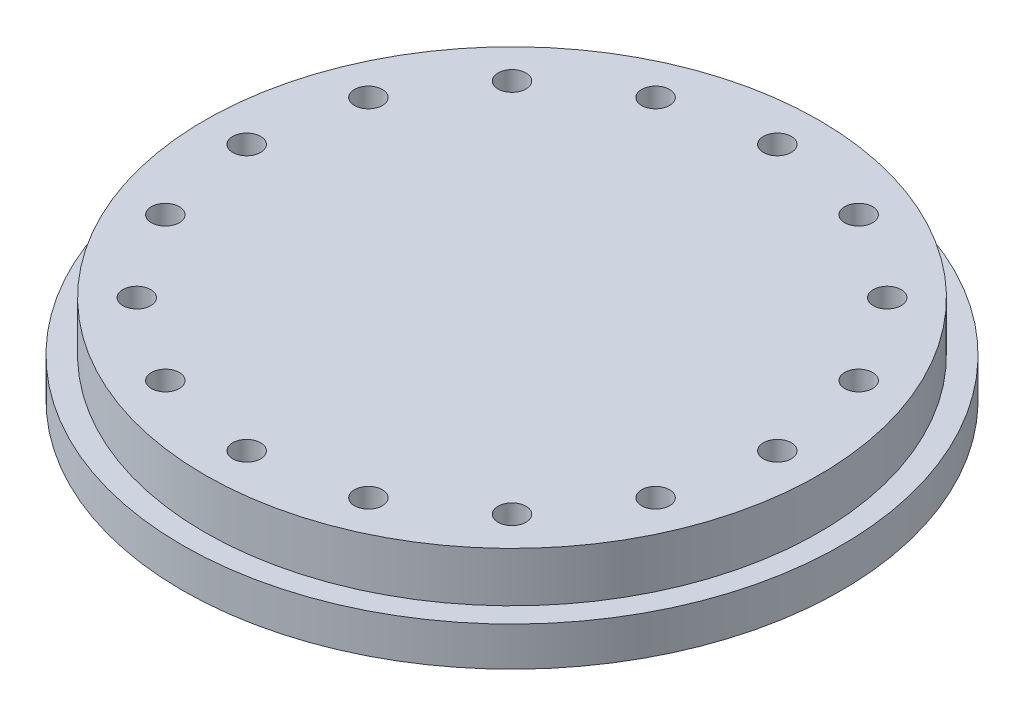
ISO-10303-21;
HEADER;
FILE_DESCRIPTION(('STEP AP214'),'2;1');
FILE_NAME('part.step','',(''),(''),'','','');
FILE_SCHEMA(('AUTOMOTIVE_DESIGN { 1 0 10303 214 1 1 1 1 }'));
ENDSEC;
DATA;
#1=APPLICATION_CONTEXT('core data for automotive mechanical design processes');
#2=APPLICATION_PROTOCOL_DEFINITION('international standard','automotive_design',2000,#1);
#3=PRODUCT_CONTEXT('',#1,'mechanical');
#4=PRODUCT('Part','Part','',(#3));
#5=PRODUCT_RELATED_PRODUCT_CATEGORY('part','',(#4));
#6=PRODUCT_DEFINITION_FORMATION('','',#4);
#7=PRODUCT_DEFINITION_CONTEXT('part definition',#1,'design');
#8=PRODUCT_DEFINITION('design','',#6,#7);
#9=PRODUCT_DEFINITION_SHAPE('','',#8);
#10=(LENGTH_UNIT() NAMED_UNIT(*) SI_UNIT(.MILLI.,.METRE.));
#11=(NAMED_UNIT(*) PLANE_ANGLE_UNIT() SI_UNIT($,.RADIAN.));
#12=(NAMED_UNIT(*) SI_UNIT($,.STERADIAN.) SOLID_ANGLE_UNIT());
#13=UNCERTAINTY_MEASURE_WITH_UNIT(LENGTH_MEASURE(1.E-05),#10,'distance_accuracy_value','');
#14=(GEOMETRIC_REPRESENTATION_CONTEXT(3) GLOBAL_UNCERTAINTY_ASSIGNED_CONTEXT((#13)) GLOBAL_UNIT_ASSIGNED_CONTEXT((#10,
#11,#12)) REPRESENTATION_CONTEXT('',''));
#15=CARTESIAN_POINT('',(0.,0.,0.));
#16=DIRECTION('',(0.,0.,1.));
#17=DIRECTION('',(1.,0.,0.));
#18=AXIS2_PLACEMENT_3D('',#15,#16,#17);
#19=CARTESIAN_POINT('',(0.,1.75,0.));
#20=DIRECTION('',(0.,-1.,0.));
#21=DIRECTION('',(0.,0.,-1.));
#22=AXIS2_PLACEMENT_3D('',#19,#20,#21);
#23=CYLINDRICAL_SURFACE('',#22,29.5);
#24=CARTESIAN_POINT('',(0.,1.75,0.));
#25=DIRECTION('',(0.,1.,0.));
#26=DIRECTION('',(0.,0.,1.));
#27=AXIS2_PLACEMENT_3D('',#24,#25,#26);
#28=CIRCLE('',#27,29.5);
#29=CARTESIAN_POINT('',(0.,1.75,29.5));
#30=VERTEX_POINT('',#29);
#31=EDGE_CURVE('E44',#30,#30,#28,.T.);
#32=ORIENTED_EDGE('',*,*,#31,.F.);
#33=EDGE_LOOP('',(#32));
#34=FACE_BOUND('',#33,.T.);
#35=CARTESIAN_POINT('',(0.,-1.75,0.));
#36=DIRECTION('',(0.,1.,0.));
#37=DIRECTION('',(0.,0.,1.));
#38=AXIS2_PLACEMENT_3D('',#35,#36,#37);
#39=CIRCLE('',#38,29.5);
#40=CARTESIAN_POINT('',(0.,-1.75,29.5));
#41=VERTEX_POINT('',#40);
#42=EDGE_CURVE('E40',#41,#41,#39,.T.);
#43=ORIENTED_EDGE('',*,*,#42,.T.);
#44=EDGE_LOOP('',(#43));
#45=FACE_BOUND('',#44,.T.);
#46=ADVANCED_FACE('F37',(#34,#45),#23,.T.);
#47=CARTESIAN_POINT('',(0.,1.75,0.));
#48=DIRECTION('',(0.,1.,0.));
#49=DIRECTION('',(0.,0.,1.));
#50=AXIS2_PLACEMENT_3D('',#47,#48,#49);
#51=PLANE('',#50);
#52=CARTESIAN_POINT('',(0.,1.75,0.));
#53=DIRECTION('',(0.,1.,0.));
#54=DIRECTION('',(0.,0.,1.));
#55=AXIS2_PLACEMENT_3D('',#52,#53,#54);
#56=CIRCLE('',#55,27.5);
#57=CARTESIAN_POINT('',(0.,1.75,27.5));
#58=VERTEX_POINT('',#57);
#59=EDGE_CURVE('E10',#58,#58,#56,.T.);
#60=ORIENTED_EDGE('',*,*,#59,.F.);
#61=EDGE_LOOP('',(#60));
#62=FACE_BOUND('',#61,.T.);
#63=ORIENTED_EDGE('',*,*,#31,.T.);
#64=EDGE_LOOP('',(#63));
#65=FACE_BOUND('',#64,.T.);
#66=ADVANCED_FACE('F165',(#62,#65),#51,.T.);
#67=CARTESIAN_POINT('',(0.,-1.75,0.));
#68=DIRECTION('',(0.,1.,0.));
#69=DIRECTION('',(0.,0.,1.));
#70=AXIS2_PLACEMENT_3D('',#67,#68,#69);
#71=PLANE('',#70);
#72=CARTESIAN_POINT('',(-16.7937860531805,-1.75,16.7937860531805));
#73=DIRECTION('',(0.,-1.,0.));
#74=DIRECTION('',(0.707106781186549,0.,-0.707106781186546));
#75=AXIS2_PLACEMENT_3D('',#72,#73,#74);
#76=CIRCLE('',#75,1.25);
#77=CARTESIAN_POINT('',(-15.9099025766974,-1.75,15.9099025766973));
#78=VERTEX_POINT('',#77);
#79=EDGE_CURVE('E109',#78,#78,#76,.T.);
#80=ORIENTED_EDGE('',*,*,#79,.F.);
#81=EDGE_LOOP('',(#80));
#82=FACE_BOUND('',#81,.T.);
#83=CARTESIAN_POINT('',(-21.9421388971431,-1.75,9.08873151867083));
#84=DIRECTION('',(0.,-1.,0.));
#85=DIRECTION('',(0.923879532511288,0.,-0.382683432365087));
#86=AXIS2_PLACEMENT_3D('',#83,#84,#85);
#87=CIRCLE('',#86,1.25);
#88=CARTESIAN_POINT('',(-20.787289481504,-1.75,8.61037722821447));
#89=VERTEX_POINT('',#88);
#90=EDGE_CURVE('E103',#89,#89,#87,.T.);
#91=ORIENTED_EDGE('',*,*,#90,.F.);
#92=EDGE_LOOP('',(#91));
#93=FACE_BOUND('',#92,.T.);
#94=CARTESIAN_POINT('',(-23.75,-1.75,0.));
#95=DIRECTION('',(0.,-1.,0.));
#96=DIRECTION('',(1.,0.,0.));
#97=AXIS2_PLACEMENT_3D('',#94,#95,#96);
#98=CIRCLE('',#97,1.25);
#99=CARTESIAN_POINT('',(-22.5,-1.75,0.));
#100=VERTEX_POINT('',#99);
#101=EDGE_CURVE('E97',#100,#100,#98,.T.);
#102=ORIENTED_EDGE('',*,*,#101,.F.);
#103=EDGE_LOOP('',(#102));
#104=FACE_BOUND('',#103,.T.);
#105=CARTESIAN_POINT('',(-21.942138897143,-1.75,-9.08873151867098));
#106=DIRECTION('',(0.,-1.,0.));
#107=DIRECTION('',(0.923879532511285,0.,0.382683432365094));
#108=AXIS2_PLACEMENT_3D('',#105,#106,#107);
#109=CIRCLE('',#108,1.25);
#110=CARTESIAN_POINT('',(-20.7872894815039,-1.75,-8.61037722821461));
#111=VERTEX_POINT('',#110);
#112=EDGE_CURVE('E91',#111,#111,#109,.T.);
#113=ORIENTED_EDGE('',*,*,#112,.F.);
#114=EDGE_LOOP('',(#113));
#115=FACE_BOUND('',#114,.T.);
#116=CARTESIAN_POINT('',(-16.7937860531804,-1.75,-16.7937860531806));
#117=DIRECTION('',(0.,-1.,0.));
#118=DIRECTION('',(0.707106781186544,0.,0.707106781186551));
#119=AXIS2_PLACEMENT_3D('',#116,#117,#118);
#120=CIRCLE('',#119,1.25);
#121=CARTESIAN_POINT('',(-15.9099025766972,-1.75,-15.9099025766974));
#122=VERTEX_POINT('',#121);
#123=EDGE_CURVE('E85',#122,#122,#120,.T.);
#124=ORIENTED_EDGE('',*,*,#123,.F.);
#125=EDGE_LOOP('',(#124));
#126=FACE_BOUND('',#125,.T.);
#127=CARTESIAN_POINT('',(-9.08873151867075,-1.75,-21.9421388971431));
#128=DIRECTION('',(0.,-1.,0.));
#129=DIRECTION('',(0.382683432365084,0.,0.923879532511289));
#130=AXIS2_PLACEMENT_3D('',#127,#128,#129);
#131=CIRCLE('',#130,1.25);
#132=CARTESIAN_POINT('',(-8.61037722821439,-1.75,-20.787289481504));
#133=VERTEX_POINT('',#132);
#134=EDGE_CURVE('E79',#133,#133,#131,.T.);
#135=ORIENTED_EDGE('',*,*,#134,.F.);
#136=EDGE_LOOP('',(#135));
#137=FACE_BOUND('',#136,.T.);
#138=CARTESIAN_POINT('',(0.,-1.75,-23.75));
#139=DIRECTION('',(0.,-1.,0.));
#140=DIRECTION('',(0.,0.,1.));
#141=AXIS2_PLACEMENT_3D('',#138,#139,#140);
#142=CIRCLE('',#141,1.25);
#143=CARTESIAN_POINT('',(0.,-1.75,-22.5));
#144=VERTEX_POINT('',#143);
#145=EDGE_CURVE('E73',#144,#144,#142,.T.);
#146=ORIENTED_EDGE('',*,*,#145,.F.);
#147=EDGE_LOOP('',(#146));
#148=FACE_BOUND('',#147,.T.);
#149=CARTESIAN_POINT('',(9.08873151867106,-1.75,-21.942138897143));
#150=DIRECTION('',(0.,-1.,0.));
#151=DIRECTION('',(-0.382683432365097,0.,0.923879532511284));
#152=AXIS2_PLACEMENT_3D('',#149,#150,#151);
#153=CIRCLE('',#152,1.25);
#154=CARTESIAN_POINT('',(8.61037722821469,-1.75,-20.7872894815039));
#155=VERTEX_POINT('',#154);
#156=EDGE_CURVE('E66',#155,#155,#153,.T.);
#157=ORIENTED_EDGE('',*,*,#156,.F.);
#158=EDGE_LOOP('',(#157));
#159=FACE_BOUND('',#158,.T.);
#160=CARTESIAN_POINT('',(16.7937860531807,-1.75,-16.7937860531804));
#161=DIRECTION('',(0.,-1.,0.));
#162=DIRECTION('',(-0.707106781186554,0.,0.707106781186541));
#163=AXIS2_PLACEMENT_3D('',#160,#161,#162);
#164=CIRCLE('',#163,1.25);
#165=CARTESIAN_POINT('',(15.9099025766975,-1.75,-15.9099025766972));
#166=VERTEX_POINT('',#165);
#167=EDGE_CURVE('E144',#166,#166,#164,.T.);
#168=ORIENTED_EDGE('',*,*,#167,.F.);
#169=EDGE_LOOP('',(#168));
#170=FACE_BOUND('',#169,.T.);
#171=CARTESIAN_POINT('',(21.9421388971432,-1.75,-9.08873151867066));
#172=DIRECTION('',(0.,-1.,0.));
#173=DIRECTION('',(-0.923879532511291,0.,0.382683432365081));
#174=AXIS2_PLACEMENT_3D('',#171,#172,#173);
#175=CIRCLE('',#174,1.25);
#176=CARTESIAN_POINT('',(20.787289481504,-1.75,-8.61037722821431));
#177=VERTEX_POINT('',#176);
#178=EDGE_CURVE('E138',#177,#177,#175,.T.);
#179=ORIENTED_EDGE('',*,*,#178,.F.);
#180=EDGE_LOOP('',(#179));
#181=FACE_BOUND('',#180,.T.);
#182=CARTESIAN_POINT('',(23.75,-1.75,2.48768045392573E-13));
#183=DIRECTION('',(0.,-1.,0.));
#184=DIRECTION('',(-1.,0.,0.));
#185=AXIS2_PLACEMENT_3D('',#182,#183,#184);
#186=CIRCLE('',#185,1.25);
#187=CARTESIAN_POINT('',(22.5,-1.75,2.35674990371912E-13));
#188=VERTEX_POINT('',#187);
#189=EDGE_CURVE('E132',#188,#188,#186,.T.);
#190=ORIENTED_EDGE('',*,*,#189,.F.);
#191=EDGE_LOOP('',(#190));
#192=FACE_BOUND('',#191,.T.);
#193=CARTESIAN_POINT('',(21.942138897143,-1.75,9.08873151867112));
#194=DIRECTION('',(0.,-1.,0.));
#195=DIRECTION('',(-0.923879532511283,0.,-0.3826834323651));
#196=AXIS2_PLACEMENT_3D('',#193,#194,#195);
#197=CIRCLE('',#196,1.25);
#198=CARTESIAN_POINT('',(20.7872894815039,-1.75,8.61037722821475));
#199=VERTEX_POINT('',#198);
#200=EDGE_CURVE('E126',#199,#199,#197,.T.);
#201=ORIENTED_EDGE('',*,*,#200,.F.);
#202=EDGE_LOOP('',(#201));
#203=FACE_BOUND('',#202,.T.);
#204=CARTESIAN_POINT('',(16.7937860531803,-1.75,16.7937860531807));
#205=DIRECTION('',(0.,-1.,0.));
#206=DIRECTION('',(-0.707106781186539,0.,-0.707106781186556));
#207=AXIS2_PLACEMENT_3D('',#204,#205,#206);
#208=CIRCLE('',#207,1.25);
#209=CARTESIAN_POINT('',(15.9099025766971,-1.75,15.9099025766975));
#210=VERTEX_POINT('',#209);
#211=EDGE_CURVE('E120',#210,#210,#208,.T.);
#212=ORIENTED_EDGE('',*,*,#211,.F.);
#213=EDGE_LOOP('',(#212));
#214=FACE_BOUND('',#213,.T.);
#215=CARTESIAN_POINT('',(9.08873151867059,-1.75,21.9421388971432));
#216=DIRECTION('',(0.,-1.,0.));
#217=DIRECTION('',(-0.382683432365077,0.,-0.923879532511292));
#218=AXIS2_PLACEMENT_3D('',#215,#216,#217);
#219=CIRCLE('',#218,1.25);
#220=CARTESIAN_POINT('',(8.61037722821424,-1.75,20.7872894815041));
#221=VERTEX_POINT('',#220);
#222=EDGE_CURVE('E114',#221,#221,#219,.T.);
#223=ORIENTED_EDGE('',*,*,#222,.F.);
#224=EDGE_LOOP('',(#223));
#225=FACE_BOUND('',#224,.T.);
#226=CARTESIAN_POINT('',(-9.0887315186709,-1.75,21.9421388971431));
#227=DIRECTION('',(0.,-1.,0.));
#228=DIRECTION('',(0.382683432365091,0.,-0.923879532511287));
#229=AXIS2_PLACEMENT_3D('',#226,#227,#228);
#230=CIRCLE('',#229,1.25);
#231=CARTESIAN_POINT('',(-8.61037722821454,-1.75,20.787289481504));
#232=VERTEX_POINT('',#231);
#233=EDGE_CURVE('E60',#232,#232,#230,.T.);
#234=ORIENTED_EDGE('',*,*,#233,.F.);
#235=EDGE_LOOP('',(#234));
#236=FACE_BOUND('',#235,.T.);
#237=CARTESIAN_POINT('',(0.,-1.75,23.75));
#238=DIRECTION('',(0.,-1.,0.));
#239=DIRECTION('',(0.,0.,-1.));
#240=AXIS2_PLACEMENT_3D('',#237,#238,#239);
#241=CIRCLE('',#240,1.25);
#242=CARTESIAN_POINT('',(0.,-1.75,22.5));
#243=VERTEX_POINT('',#242);
#244=EDGE_CURVE('E54',#243,#243,#241,.T.);
#245=ORIENTED_EDGE('',*,*,#244,.F.);
#246=EDGE_LOOP('',(#245));
#247=FACE_BOUND('',#246,.T.);
#248=ORIENTED_EDGE('',*,*,#42,.F.);
#249=EDGE_LOOP('',(#248));
#250=FACE_BOUND('',#249,.T.);
#251=ADVANCED_FACE('F161',(#82,#93,#104,#115,#126,#137,#148,#159,#170,#181,#192,#203,#214,#225,
#236,#247,#250),#71,.F.);
#252=CARTESIAN_POINT('',(0.,6.2,0.));
#253=DIRECTION('',(0.,-1.,0.));
#254=DIRECTION('',(0.,0.,-1.));
#255=AXIS2_PLACEMENT_3D('',#252,#253,#254);
#256=CYLINDRICAL_SURFACE('',#255,27.5);
#257=CARTESIAN_POINT('',(0.,6.2,0.));
#258=DIRECTION('',(0.,1.,0.));
#259=DIRECTION('',(0.,0.,1.));
#260=AXIS2_PLACEMENT_3D('',#257,#258,#259);
#261=CIRCLE('',#260,27.5);
#262=CARTESIAN_POINT('',(0.,6.2,27.5));
#263=VERTEX_POINT('',#262);
#264=EDGE_CURVE('E50',#263,#263,#261,.T.);
#265=ORIENTED_EDGE('',*,*,#264,.F.);
#266=EDGE_LOOP('',(#265));
#267=FACE_BOUND('',#266,.T.);
#268=ORIENTED_EDGE('',*,*,#59,.T.);
#269=EDGE_LOOP('',(#268));
#270=FACE_BOUND('',#269,.T.);
#271=ADVANCED_FACE('F164',(#267,#270),#256,.T.);
#272=CARTESIAN_POINT('',(0.,6.2,0.));
#273=DIRECTION('',(0.,1.,0.));
#274=DIRECTION('',(0.,0.,1.));
#275=AXIS2_PLACEMENT_3D('',#272,#273,#274);
#276=PLANE('',#275);
#277=CARTESIAN_POINT('',(-16.7937860531805,6.2,16.7937860531805));
#278=DIRECTION('',(0.,-1.,0.));
#279=DIRECTION('',(0.707106781186549,0.,-0.707106781186546));
#280=AXIS2_PLACEMENT_3D('',#277,#278,#279);
#281=CIRCLE('',#280,1.25);
#282=CARTESIAN_POINT('',(-15.9099025766974,6.2,15.9099025766973));
#283=VERTEX_POINT('',#282);
#284=EDGE_CURVE('E63',#283,#283,#281,.T.);
#285=ORIENTED_EDGE('',*,*,#284,.T.);
#286=EDGE_LOOP('',(#285));
#287=FACE_BOUND('',#286,.T.);
#288=CARTESIAN_POINT('',(-21.9421388971431,6.2,9.08873151867083));
#289=DIRECTION('',(0.,-1.,0.));
#290=DIRECTION('',(0.923879532511288,0.,-0.382683432365087));
#291=AXIS2_PLACEMENT_3D('',#288,#289,#290);
#292=CIRCLE('',#291,1.25);
#293=CARTESIAN_POINT('',(-20.787289481504,6.2,8.61037722821447));
#294=VERTEX_POINT('',#293);
#295=EDGE_CURVE('E106',#294,#294,#292,.T.);
#296=ORIENTED_EDGE('',*,*,#295,.T.);
#297=EDGE_LOOP('',(#296));
#298=FACE_BOUND('',#297,.T.);
#299=CARTESIAN_POINT('',(-23.75,6.2,0.));
#300=DIRECTION('',(0.,-1.,0.));
#301=DIRECTION('',(1.,0.,0.));
#302=AXIS2_PLACEMENT_3D('',#299,#300,#301);
#303=CIRCLE('',#302,1.25);
#304=CARTESIAN_POINT('',(-22.5,6.2,0.));
#305=VERTEX_POINT('',#304);
#306=EDGE_CURVE('E100',#305,#305,#303,.T.);
#307=ORIENTED_EDGE('',*,*,#306,.T.);
#308=EDGE_LOOP('',(#307));
#309=FACE_BOUND('',#308,.T.);
#310=CARTESIAN_POINT('',(-21.942138897143,6.2,-9.08873151867098));
#311=DIRECTION('',(0.,-1.,0.));
#312=DIRECTION('',(0.923879532511285,0.,0.382683432365094));
#313=AXIS2_PLACEMENT_3D('',#310,#311,#312);
#314=CIRCLE('',#313,1.25);
#315=CARTESIAN_POINT('',(-20.7872894815039,6.2,-8.61037722821461));
#316=VERTEX_POINT('',#315);
#317=EDGE_CURVE('E94',#316,#316,#314,.T.);
#318=ORIENTED_EDGE('',*,*,#317,.T.);
#319=EDGE_LOOP('',(#318));
#320=FACE_BOUND('',#319,.T.);
#321=CARTESIAN_POINT('',(-16.7937860531804,6.2,-16.7937860531806));
#322=DIRECTION('',(0.,-1.,0.));
#323=DIRECTION('',(0.707106781186544,0.,0.707106781186551));
#324=AXIS2_PLACEMENT_3D('',#321,#322,#323);
#325=CIRCLE('',#324,1.25);
#326=CARTESIAN_POINT('',(-15.9099025766972,6.2,-15.9099025766974));
#327=VERTEX_POINT('',#326);
#328=EDGE_CURVE('E88',#327,#327,#325,.T.);
#329=ORIENTED_EDGE('',*,*,#328,.T.);
#330=EDGE_LOOP('',(#329));
#331=FACE_BOUND('',#330,.T.);
#332=CARTESIAN_POINT('',(-9.08873151867075,6.2,-21.9421388971431));
#333=DIRECTION('',(0.,-1.,0.));
#334=DIRECTION('',(0.382683432365084,0.,0.923879532511289));
#335=AXIS2_PLACEMENT_3D('',#332,#333,#334);
#336=CIRCLE('',#335,1.25);
#337=CARTESIAN_POINT('',(-8.61037722821439,6.2,-20.787289481504));
#338=VERTEX_POINT('',#337);
#339=EDGE_CURVE('E82',#338,#338,#336,.T.);
#340=ORIENTED_EDGE('',*,*,#339,.T.);
#341=EDGE_LOOP('',(#340));
#342=FACE_BOUND('',#341,.T.);
#343=CARTESIAN_POINT('',(0.,6.2,-23.75));
#344=DIRECTION('',(0.,-1.,0.));
#345=DIRECTION('',(0.,0.,1.));
#346=AXIS2_PLACEMENT_3D('',#343,#344,#345);
#347=CIRCLE('',#346,1.25);
#348=CARTESIAN_POINT('',(0.,6.2,-22.5));
#349=VERTEX_POINT('',#348);
#350=EDGE_CURVE('E76',#349,#349,#347,.T.);
#351=ORIENTED_EDGE('',*,*,#350,.T.);
#352=EDGE_LOOP('',(#351));
#353=FACE_BOUND('',#352,.T.);
#354=CARTESIAN_POINT('',(9.08873151867106,6.2,-21.942138897143));
#355=DIRECTION('',(0.,-1.,0.));
#356=DIRECTION('',(-0.382683432365097,0.,0.923879532511284));
#357=AXIS2_PLACEMENT_3D('',#354,#355,#356);
#358=CIRCLE('',#357,1.25);
#359=CARTESIAN_POINT('',(8.61037722821469,6.2,-20.7872894815039));
#360=VERTEX_POINT('',#359);
#361=EDGE_CURVE('E69',#360,#360,#358,.T.);
#362=ORIENTED_EDGE('',*,*,#361,.T.);
#363=EDGE_LOOP('',(#362));
#364=FACE_BOUND('',#363,.T.);
#365=CARTESIAN_POINT('',(16.7937860531807,6.2,-16.7937860531804));
#366=DIRECTION('',(0.,-1.,0.));
#367=DIRECTION('',(-0.707106781186554,0.,0.707106781186541));
#368=AXIS2_PLACEMENT_3D('',#365,#366,#367);
#369=CIRCLE('',#368,1.25);
#370=CARTESIAN_POINT('',(15.9099025766975,6.2,-15.9099025766972));
#371=VERTEX_POINT('',#370);
#372=EDGE_CURVE('E70',#371,#371,#369,.T.);
#373=ORIENTED_EDGE('',*,*,#372,.T.);
#374=EDGE_LOOP('',(#373));
#375=FACE_BOUND('',#374,.T.);
#376=CARTESIAN_POINT('',(21.9421388971432,6.2,-9.08873151867066));
#377=DIRECTION('',(0.,-1.,0.));
#378=DIRECTION('',(-0.923879532511291,0.,0.382683432365081));
#379=AXIS2_PLACEMENT_3D('',#376,#377,#378);
#380=CIRCLE('',#379,1.25);
#381=CARTESIAN_POINT('',(20.787289481504,6.2,-8.61037722821431));
#382=VERTEX_POINT('',#381);
#383=EDGE_CURVE('E141',#382,#382,#380,.T.);
#384=ORIENTED_EDGE('',*,*,#383,.T.);
#385=EDGE_LOOP('',(#384));
#386=FACE_BOUND('',#385,.T.);
#387=CARTESIAN_POINT('',(23.75,6.2,2.48768045392573E-13));
#388=DIRECTION('',(0.,-1.,0.));
#389=DIRECTION('',(-1.,0.,0.));
#390=AXIS2_PLACEMENT_3D('',#387,#388,#389);
#391=CIRCLE('',#390,1.25);
#392=CARTESIAN_POINT('',(22.5,6.2,2.35674990371912E-13));
#393=VERTEX_POINT('',#392);
#394=EDGE_CURVE('E135',#393,#393,#391,.T.);
#395=ORIENTED_EDGE('',*,*,#394,.T.);
#396=EDGE_LOOP('',(#395));
#397=FACE_BOUND('',#396,.T.);
#398=CARTESIAN_POINT('',(21.942138897143,6.2,9.08873151867112));
#399=DIRECTION('',(0.,-1.,0.));
#400=DIRECTION('',(-0.923879532511283,0.,-0.3826834323651));
#401=AXIS2_PLACEMENT_3D('',#398,#399,#400);
#402=CIRCLE('',#401,1.25);
#403=CARTESIAN_POINT('',(20.7872894815039,6.2,8.61037722821475));
#404=VERTEX_POINT('',#403);
#405=EDGE_CURVE('E129',#404,#404,#402,.T.);
#406=ORIENTED_EDGE('',*,*,#405,.T.);
#407=EDGE_LOOP('',(#406));
#408=FACE_BOUND('',#407,.T.);
#409=CARTESIAN_POINT('',(16.7937860531803,6.2,16.7937860531807));
#410=DIRECTION('',(0.,-1.,0.));
#411=DIRECTION('',(-0.707106781186539,0.,-0.707106781186556));
#412=AXIS2_PLACEMENT_3D('',#409,#410,#411);
#413=CIRCLE('',#412,1.25);
#414=CARTESIAN_POINT('',(15.9099025766971,6.2,15.9099025766975));
#415=VERTEX_POINT('',#414);
#416=EDGE_CURVE('E123',#415,#415,#413,.T.);
#417=ORIENTED_EDGE('',*,*,#416,.T.);
#418=EDGE_LOOP('',(#417));
#419=FACE_BOUND('',#418,.T.);
#420=CARTESIAN_POINT('',(9.08873151867059,6.2,21.9421388971432));
#421=DIRECTION('',(0.,-1.,0.));
#422=DIRECTION('',(-0.382683432365077,0.,-0.923879532511292));
#423=AXIS2_PLACEMENT_3D('',#420,#421,#422);
#424=CIRCLE('',#423,1.25);
#425=CARTESIAN_POINT('',(8.61037722821424,6.2,20.7872894815041));
#426=VERTEX_POINT('',#425);
#427=EDGE_CURVE('E117',#426,#426,#424,.T.);
#428=ORIENTED_EDGE('',*,*,#427,.T.);
#429=EDGE_LOOP('',(#428));
#430=FACE_BOUND('',#429,.T.);
#431=CARTESIAN_POINT('',(-9.0887315186709,6.2,21.9421388971431));
#432=DIRECTION('',(0.,-1.,0.));
#433=DIRECTION('',(0.382683432365091,0.,-0.923879532511287));
#434=AXIS2_PLACEMENT_3D('',#431,#432,#433);
#435=CIRCLE('',#434,1.25);
#436=CARTESIAN_POINT('',(-8.61037722821454,6.2,20.787289481504));
#437=VERTEX_POINT('',#436);
#438=EDGE_CURVE('E57',#437,#437,#435,.T.);
#439=ORIENTED_EDGE('',*,*,#438,.T.);
#440=EDGE_LOOP('',(#439));
#441=FACE_BOUND('',#440,.T.);
#442=CARTESIAN_POINT('',(0.,6.2,23.75));
#443=DIRECTION('',(0.,-1.,0.));
#444=DIRECTION('',(0.,0.,-1.));
#445=AXIS2_PLACEMENT_3D('',#442,#443,#444);
#446=CIRCLE('',#445,1.25);
#447=CARTESIAN_POINT('',(0.,6.2,22.5));
#448=VERTEX_POINT('',#447);
#449=EDGE_CURVE('E53',#448,#448,#446,.T.);
#450=ORIENTED_EDGE('',*,*,#449,.T.);
#451=EDGE_LOOP('',(#450));
#452=FACE_BOUND('',#451,.T.);
#453=ORIENTED_EDGE('',*,*,#264,.T.);
#454=EDGE_LOOP('',(#453));
#455=FACE_BOUND('',#454,.T.);
#456=ADVANCED_FACE('F150',(#287,#298,#309,#320,#331,#342,#353,#364,#375,#386,#397,#408,#419,
#430,#441,#452,#455),#276,.T.);
#457=CARTESIAN_POINT('',(0.,6.2,23.75));
#458=DIRECTION('',(0.,-1.,0.));
#459=DIRECTION('',(0.,0.,-1.));
#460=AXIS2_PLACEMENT_3D('',#457,#458,#459);
#461=CYLINDRICAL_SURFACE('',#460,1.25);
#462=ORIENTED_EDGE('',*,*,#449,.F.);
#463=EDGE_LOOP('',(#462));
#464=FACE_BOUND('',#463,.T.);
#465=ORIENTED_EDGE('',*,*,#244,.T.);
#466=EDGE_LOOP('',(#465));
#467=FACE_BOUND('',#466,.T.);
#468=ADVANCED_FACE('F201',(#464,#467),#461,.F.);
#469=CARTESIAN_POINT('',(-9.0887315186709,6.2,21.9421388971431));
#470=DIRECTION('',(0.,-1.,0.));
#471=DIRECTION('',(0.,0.,-1.));
#472=AXIS2_PLACEMENT_3D('',#469,#470,#471);
#473=CYLINDRICAL_SURFACE('',#472,1.25);
#474=ORIENTED_EDGE('',*,*,#438,.F.);
#475=EDGE_LOOP('',(#474));
#476=FACE_BOUND('',#475,.T.);
#477=ORIENTED_EDGE('',*,*,#233,.T.);
#478=EDGE_LOOP('',(#477));
#479=FACE_BOUND('',#478,.T.);
#480=ADVANCED_FACE('F205',(#476,#479),#473,.F.);
#481=CARTESIAN_POINT('',(9.08873151867059,6.2,21.9421388971432));
#482=DIRECTION('',(0.,-1.,0.));
#483=DIRECTION('',(0.,0.,-1.));
#484=AXIS2_PLACEMENT_3D('',#481,#482,#483);
#485=CYLINDRICAL_SURFACE('',#484,1.25);
#486=ORIENTED_EDGE('',*,*,#427,.F.);
#487=EDGE_LOOP('',(#486));
#488=FACE_BOUND('',#487,.T.);
#489=ORIENTED_EDGE('',*,*,#222,.T.);
#490=EDGE_LOOP('',(#489));
#491=FACE_BOUND('',#490,.T.);
#492=ADVANCED_FACE('F209',(#488,#491),#485,.F.);
#493=CARTESIAN_POINT('',(16.7937860531803,6.2,16.7937860531807));
#494=DIRECTION('',(0.,-1.,0.));
#495=DIRECTION('',(0.,0.,-1.));
#496=AXIS2_PLACEMENT_3D('',#493,#494,#495);
#497=CYLINDRICAL_SURFACE('',#496,1.25);
#498=ORIENTED_EDGE('',*,*,#416,.F.);
#499=EDGE_LOOP('',(#498));
#500=FACE_BOUND('',#499,.T.);
#501=ORIENTED_EDGE('',*,*,#211,.T.);
#502=EDGE_LOOP('',(#501));
#503=FACE_BOUND('',#502,.T.);
#504=ADVANCED_FACE('F244',(#500,#503),#497,.F.);
#505=CARTESIAN_POINT('',(21.942138897143,6.2,9.08873151867112));
#506=DIRECTION('',(0.,-1.,0.));
#507=DIRECTION('',(0.,0.,-1.));
#508=AXIS2_PLACEMENT_3D('',#505,#506,#507);
#509=CYLINDRICAL_SURFACE('',#508,1.25);
#510=ORIENTED_EDGE('',*,*,#405,.F.);
#511=EDGE_LOOP('',(#510));
#512=FACE_BOUND('',#511,.T.);
#513=ORIENTED_EDGE('',*,*,#200,.T.);
#514=EDGE_LOOP('',(#513));
#515=FACE_BOUND('',#514,.T.);
#516=ADVANCED_FACE('F248',(#512,#515),#509,.F.);
#517=CARTESIAN_POINT('',(23.75,6.2,2.48768045392573E-13));
#518=DIRECTION('',(0.,-1.,0.));
#519=DIRECTION('',(0.,0.,-1.));
#520=AXIS2_PLACEMENT_3D('',#517,#518,#519);
#521=CYLINDRICAL_SURFACE('',#520,1.25);
#522=ORIENTED_EDGE('',*,*,#394,.F.);
#523=EDGE_LOOP('',(#522));
#524=FACE_BOUND('',#523,.T.);
#525=ORIENTED_EDGE('',*,*,#189,.T.);
#526=EDGE_LOOP('',(#525));
#527=FACE_BOUND('',#526,.T.);
#528=ADVANCED_FACE('F252',(#524,#527),#521,.F.);
#529=CARTESIAN_POINT('',(21.9421388971432,6.2,-9.08873151867066));
#530=DIRECTION('',(0.,-1.,0.));
#531=DIRECTION('',(0.,0.,-1.));
#532=AXIS2_PLACEMENT_3D('',#529,#530,#531);
#533=CYLINDRICAL_SURFACE('',#532,1.25);
#534=ORIENTED_EDGE('',*,*,#383,.F.);
#535=EDGE_LOOP('',(#534));
#536=FACE_BOUND('',#535,.T.);
#537=ORIENTED_EDGE('',*,*,#178,.T.);
#538=EDGE_LOOP('',(#537));
#539=FACE_BOUND('',#538,.T.);
#540=ADVANCED_FACE('F157',(#536,#539),#533,.F.);
#541=CARTESIAN_POINT('',(16.7937860531807,6.2,-16.7937860531804));
#542=DIRECTION('',(0.,-1.,0.));
#543=DIRECTION('',(0.,0.,-1.));
#544=AXIS2_PLACEMENT_3D('',#541,#542,#543);
#545=CYLINDRICAL_SURFACE('',#544,1.25);
#546=ORIENTED_EDGE('',*,*,#372,.F.);
#547=EDGE_LOOP('',(#546));
#548=FACE_BOUND('',#547,.T.);
#549=ORIENTED_EDGE('',*,*,#167,.T.);
#550=EDGE_LOOP('',(#549));
#551=FACE_BOUND('',#550,.T.);
#552=ADVANCED_FACE('F153',(#548,#551),#545,.F.);
#553=CARTESIAN_POINT('',(9.08873151867106,6.2,-21.942138897143));
#554=DIRECTION('',(0.,-1.,0.));
#555=DIRECTION('',(0.,0.,-1.));
#556=AXIS2_PLACEMENT_3D('',#553,#554,#555);
#557=CYLINDRICAL_SURFACE('',#556,1.25);
#558=ORIENTED_EDGE('',*,*,#361,.F.);
#559=EDGE_LOOP('',(#558));
#560=FACE_BOUND('',#559,.T.);
#561=ORIENTED_EDGE('',*,*,#156,.T.);
#562=EDGE_LOOP('',(#561));
#563=FACE_BOUND('',#562,.T.);
#564=ADVANCED_FACE('F156',(#560,#563),#557,.F.);
#565=CARTESIAN_POINT('',(0.,6.2,-23.75));
#566=DIRECTION('',(0.,-1.,0.));
#567=DIRECTION('',(0.,0.,-1.));
#568=AXIS2_PLACEMENT_3D('',#565,#566,#567);
#569=CYLINDRICAL_SURFACE('',#568,1.25);
#570=ORIENTED_EDGE('',*,*,#350,.F.);
#571=EDGE_LOOP('',(#570));
#572=FACE_BOUND('',#571,.T.);
#573=ORIENTED_EDGE('',*,*,#145,.T.);
#574=EDGE_LOOP('',(#573));
#575=FACE_BOUND('',#574,.T.);
#576=ADVANCED_FACE('F213',(#572,#575),#569,.F.);
#577=CARTESIAN_POINT('',(-9.08873151867075,6.2,-21.9421388971431));
#578=DIRECTION('',(0.,-1.,0.));
#579=DIRECTION('',(0.,0.,-1.));
#580=AXIS2_PLACEMENT_3D('',#577,#578,#579);
#581=CYLINDRICAL_SURFACE('',#580,1.25);
#582=ORIENTED_EDGE('',*,*,#339,.F.);
#583=EDGE_LOOP('',(#582));
#584=FACE_BOUND('',#583,.T.);
#585=ORIENTED_EDGE('',*,*,#134,.T.);
#586=EDGE_LOOP('',(#585));
#587=FACE_BOUND('',#586,.T.);
#588=ADVANCED_FACE('F217',(#584,#587),#581,.F.);
#589=CARTESIAN_POINT('',(-16.7937860531804,6.2,-16.7937860531806));
#590=DIRECTION('',(0.,-1.,0.));
#591=DIRECTION('',(0.,0.,-1.));
#592=AXIS2_PLACEMENT_3D('',#589,#590,#591);
#593=CYLINDRICAL_SURFACE('',#592,1.25);
#594=ORIENTED_EDGE('',*,*,#328,.F.);
#595=EDGE_LOOP('',(#594));
#596=FACE_BOUND('',#595,.T.);
#597=ORIENTED_EDGE('',*,*,#123,.T.);
#598=EDGE_LOOP('',(#597));
#599=FACE_BOUND('',#598,.T.);
#600=ADVANCED_FACE('F221',(#596,#599),#593,.F.);
#601=CARTESIAN_POINT('',(-21.942138897143,6.2,-9.08873151867098));
#602=DIRECTION('',(0.,-1.,0.));
#603=DIRECTION('',(0.,0.,-1.));
#604=AXIS2_PLACEMENT_3D('',#601,#602,#603);
#605=CYLINDRICAL_SURFACE('',#604,1.25);
#606=ORIENTED_EDGE('',*,*,#317,.F.);
#607=EDGE_LOOP('',(#606));
#608=FACE_BOUND('',#607,.T.);
#609=ORIENTED_EDGE('',*,*,#112,.T.);
#610=EDGE_LOOP('',(#609));
#611=FACE_BOUND('',#610,.T.);
#612=ADVANCED_FACE('F225',(#608,#611),#605,.F.);
#613=CARTESIAN_POINT('',(-23.75,6.2,0.));
#614=DIRECTION('',(0.,-1.,0.));
#615=DIRECTION('',(0.,0.,-1.));
#616=AXIS2_PLACEMENT_3D('',#613,#614,#615);
#617=CYLINDRICAL_SURFACE('',#616,1.25);
#618=ORIENTED_EDGE('',*,*,#306,.F.);
#619=EDGE_LOOP('',(#618));
#620=FACE_BOUND('',#619,.T.);
#621=ORIENTED_EDGE('',*,*,#101,.T.);
#622=EDGE_LOOP('',(#621));
#623=FACE_BOUND('',#622,.T.);
#624=ADVANCED_FACE('F229',(#620,#623),#617,.F.);
#625=CARTESIAN_POINT('',(-21.9421388971431,6.2,9.08873151867083));
#626=DIRECTION('',(0.,-1.,0.));
#627=DIRECTION('',(0.,0.,-1.));
#628=AXIS2_PLACEMENT_3D('',#625,#626,#627);
#629=CYLINDRICAL_SURFACE('',#628,1.25);
#630=ORIENTED_EDGE('',*,*,#295,.F.);
#631=EDGE_LOOP('',(#630));
#632=FACE_BOUND('',#631,.T.);
#633=ORIENTED_EDGE('',*,*,#90,.T.);
#634=EDGE_LOOP('',(#633));
#635=FACE_BOUND('',#634,.T.);
#636=ADVANCED_FACE('F233',(#632,#635),#629,.F.);
#637=CARTESIAN_POINT('',(-16.7937860531805,6.2,16.7937860531805));
#638=DIRECTION('',(0.,-1.,0.));
#639=DIRECTION('',(0.,0.,-1.));
#640=AXIS2_PLACEMENT_3D('',#637,#638,#639);
#641=CYLINDRICAL_SURFACE('',#640,1.25);
#642=ORIENTED_EDGE('',*,*,#284,.F.);
#643=EDGE_LOOP('',(#642));
#644=FACE_BOUND('',#643,.T.);
#645=ORIENTED_EDGE('',*,*,#79,.T.);
#646=EDGE_LOOP('',(#645));
#647=FACE_BOUND('',#646,.T.);
#648=ADVANCED_FACE('F237',(#644,#647),#641,.F.);
#649=CLOSED_SHELL('',(#46,#66,#251,#271,#456,#468,#480,#492,#504,#516,#528,#540,#552,#564,#576,
#588,#600,#612,#624,#636,#648));
#650=MANIFOLD_SOLID_BREP('B2',#649);
#651=ADVANCED_BREP_SHAPE_REPRESENTATION('',(#18,#650),#14);
#652=SHAPE_DEFINITION_REPRESENTATION(#9,#651);
ENDSEC;
END-ISO-10303-21;
